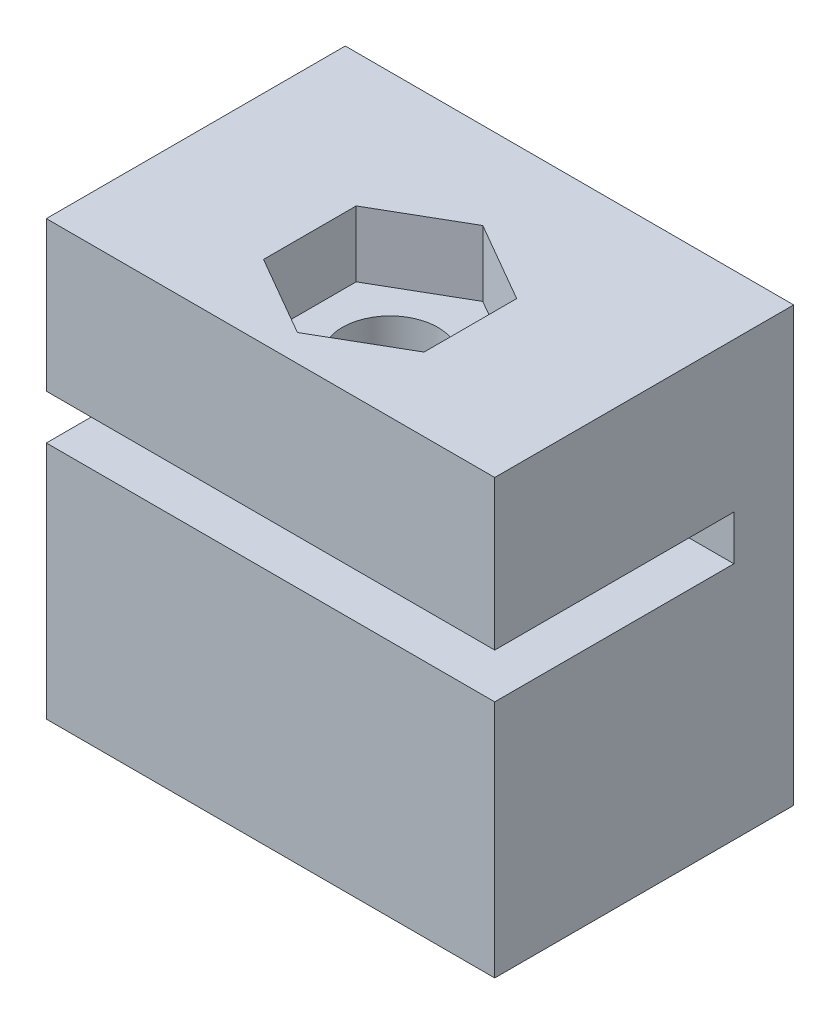
ISO-10303-21;
HEADER;
FILE_DESCRIPTION(('STEP AP214'),'2;1');
FILE_NAME('part.step','',(''),(''),'','','');
FILE_SCHEMA(('AUTOMOTIVE_DESIGN { 1 0 10303 214 1 1 1 1 }'));
ENDSEC;
DATA;
#1=APPLICATION_CONTEXT('core data for automotive mechanical design processes');
#2=APPLICATION_PROTOCOL_DEFINITION('international standard','automotive_design',2000,#1);
#3=PRODUCT_CONTEXT('',#1,'mechanical');
#4=PRODUCT('Part','Part','',(#3));
#5=PRODUCT_RELATED_PRODUCT_CATEGORY('part','',(#4));
#6=PRODUCT_DEFINITION_FORMATION('','',#4);
#7=PRODUCT_DEFINITION_CONTEXT('part definition',#1,'design');
#8=PRODUCT_DEFINITION('design','',#6,#7);
#9=PRODUCT_DEFINITION_SHAPE('','',#8);
#10=(LENGTH_UNIT() NAMED_UNIT(*) SI_UNIT(.MILLI.,.METRE.));
#11=(NAMED_UNIT(*) PLANE_ANGLE_UNIT() SI_UNIT($,.RADIAN.));
#12=(NAMED_UNIT(*) SI_UNIT($,.STERADIAN.) SOLID_ANGLE_UNIT());
#13=UNCERTAINTY_MEASURE_WITH_UNIT(LENGTH_MEASURE(1.E-05),#10,'distance_accuracy_value','');
#14=(GEOMETRIC_REPRESENTATION_CONTEXT(3) GLOBAL_UNCERTAINTY_ASSIGNED_CONTEXT((#13)) GLOBAL_UNIT_ASSIGNED_CONTEXT((#10,
#11,#12)) REPRESENTATION_CONTEXT('',''));
#15=CARTESIAN_POINT('',(0.,0.,0.));
#16=DIRECTION('',(0.,0.,1.));
#17=DIRECTION('',(1.,0.,0.));
#18=AXIS2_PLACEMENT_3D('',#15,#16,#17);
#19=CARTESIAN_POINT('',(0.,0.,1.));
#20=DIRECTION('',(0.,1.,0.));
#21=DIRECTION('',(0.,0.,1.));
#22=AXIS2_PLACEMENT_3D('',#19,#20,#21);
#23=CYLINDRICAL_SURFACE('',#22,1.6);
#24=CARTESIAN_POINT('',(0.,9.5,1.));
#25=DIRECTION('',(0.,1.,0.));
#26=DIRECTION('',(0.,0.,1.));
#27=AXIS2_PLACEMENT_3D('',#24,#25,#26);
#28=CIRCLE('',#27,1.6);
#29=CARTESIAN_POINT('',(0.,9.5,2.6));
#30=VERTEX_POINT('',#29);
#31=EDGE_CURVE('E223',#30,#30,#28,.T.);
#32=ORIENTED_EDGE('',*,*,#31,.F.);
#33=EDGE_LOOP('',(#32));
#34=FACE_BOUND('',#33,.T.);
#35=CARTESIAN_POINT('',(0.,12.3,1.));
#36=DIRECTION('',(0.,1.,0.));
#37=DIRECTION('',(0.,0.,1.));
#38=AXIS2_PLACEMENT_3D('',#35,#36,#37);
#39=CIRCLE('',#38,1.6);
#40=CARTESIAN_POINT('',(0.,12.3,2.6));
#41=VERTEX_POINT('',#40);
#42=EDGE_CURVE('E47',#41,#41,#39,.F.);
#43=ORIENTED_EDGE('',*,*,#42,.F.);
#44=EDGE_LOOP('',(#43));
#45=FACE_BOUND('',#44,.T.);
#46=ADVANCED_FACE('F43',(#34,#45),#23,.F.);
#47=CARTESIAN_POINT('',(7.5,8.,-5.));
#48=DIRECTION('',(-1.,0.,0.));
#49=DIRECTION('',(0.,0.,1.));
#50=AXIS2_PLACEMENT_3D('',#47,#48,#49);
#51=PLANE('',#50);
#52=DIRECTION('',(0.,0.,-1.));
#53=VECTOR('',#52,1.);
#54=CARTESIAN_POINT('',(7.5,0.,-5.));
#55=LINE('',#54,#53);
#56=CARTESIAN_POINT('',(7.5,0.,5.));
#57=VERTEX_POINT('',#56);
#58=CARTESIAN_POINT('',(7.5,0.,-5.));
#59=VERTEX_POINT('',#58);
#60=EDGE_CURVE('E278',#57,#59,#55,.T.);
#61=ORIENTED_EDGE('',*,*,#60,.T.);
#62=DIRECTION('',(0.,-1.,0.));
#63=VECTOR('',#62,1.);
#64=CARTESIAN_POINT('',(7.5,8.,-5.));
#65=LINE('',#64,#63);
#66=CARTESIAN_POINT('',(7.5,14.5,-5.));
#67=VERTEX_POINT('',#66);
#68=EDGE_CURVE('E11',#67,#59,#65,.T.);
#69=ORIENTED_EDGE('',*,*,#68,.F.);
#70=DIRECTION('',(0.,0.,-1.));
#71=VECTOR('',#70,1.);
#72=CARTESIAN_POINT('',(7.5,14.5,-5.));
#73=LINE('',#72,#71);
#74=CARTESIAN_POINT('',(7.5,14.5,5.));
#75=VERTEX_POINT('',#74);
#76=EDGE_CURVE('E240',#75,#67,#73,.T.);
#77=ORIENTED_EDGE('',*,*,#76,.F.);
#78=DIRECTION('',(0.,-1.,0.));
#79=VECTOR('',#78,1.);
#80=CARTESIAN_POINT('',(7.5,14.5,5.));
#81=LINE('',#80,#79);
#82=CARTESIAN_POINT('',(7.5,9.5,5.));
#83=VERTEX_POINT('',#82);
#84=EDGE_CURVE('E248',#75,#83,#81,.T.);
#85=ORIENTED_EDGE('',*,*,#84,.T.);
#86=DIRECTION('',(0.,0.,-1.));
#87=VECTOR('',#86,1.);
#88=CARTESIAN_POINT('',(7.5,9.5,-5.));
#89=LINE('',#88,#87);
#90=CARTESIAN_POINT('',(7.5,9.5,-3.));
#91=VERTEX_POINT('',#90);
#92=EDGE_CURVE('E237',#83,#91,#89,.T.);
#93=ORIENTED_EDGE('',*,*,#92,.T.);
#94=DIRECTION('',(0.,-1.,0.));
#95=VECTOR('',#94,1.);
#96=CARTESIAN_POINT('',(7.5,9.5,-3.));
#97=LINE('',#96,#95);
#98=CARTESIAN_POINT('',(7.5,8.,-3.));
#99=VERTEX_POINT('',#98);
#100=EDGE_CURVE('E268',#91,#99,#97,.T.);
#101=ORIENTED_EDGE('',*,*,#100,.T.);
#102=DIRECTION('',(0.,0.,-1.));
#103=VECTOR('',#102,1.);
#104=CARTESIAN_POINT('',(7.5,8.,-5.));
#105=LINE('',#104,#103);
#106=CARTESIAN_POINT('',(7.5,8.,5.));
#107=VERTEX_POINT('',#106);
#108=EDGE_CURVE('E279',#107,#99,#105,.T.);
#109=ORIENTED_EDGE('',*,*,#108,.F.);
#110=DIRECTION('',(0.,-1.,0.));
#111=VECTOR('',#110,1.);
#112=CARTESIAN_POINT('',(7.5,8.,5.));
#113=LINE('',#112,#111);
#114=EDGE_CURVE('E289',#107,#57,#113,.T.);
#115=ORIENTED_EDGE('',*,*,#114,.T.);
#116=EDGE_LOOP('',(#61,#69,#77,#85,#93,#101,#109,#115));
#117=FACE_BOUND('',#116,.T.);
#118=ADVANCED_FACE('F45',(#117),#51,.F.);
#119=CARTESIAN_POINT('',(-7.5,8.,-5.));
#120=DIRECTION('',(0.,0.,1.));
#121=DIRECTION('',(1.,0.,0.));
#122=AXIS2_PLACEMENT_3D('',#119,#120,#121);
#123=PLANE('',#122);
#124=DIRECTION('',(-1.,0.,0.));
#125=VECTOR('',#124,1.);
#126=CARTESIAN_POINT('',(-7.5,0.,-5.));
#127=LINE('',#126,#125);
#128=CARTESIAN_POINT('',(-7.5,0.,-5.));
#129=VERTEX_POINT('',#128);
#130=EDGE_CURVE('E293',#59,#129,#127,.T.);
#131=ORIENTED_EDGE('',*,*,#130,.T.);
#132=DIRECTION('',(0.,-1.,0.));
#133=VECTOR('',#132,1.);
#134=CARTESIAN_POINT('',(-7.5,8.,-5.));
#135=LINE('',#134,#133);
#136=CARTESIAN_POINT('',(-7.5,14.5,-5.));
#137=VERTEX_POINT('',#136);
#138=EDGE_CURVE('E53',#137,#129,#135,.T.);
#139=ORIENTED_EDGE('',*,*,#138,.F.);
#140=DIRECTION('',(-1.,0.,0.));
#141=VECTOR('',#140,1.);
#142=CARTESIAN_POINT('',(-7.5,14.5,-5.));
#143=LINE('',#142,#141);
#144=EDGE_CURVE('E244',#67,#137,#143,.T.);
#145=ORIENTED_EDGE('',*,*,#144,.F.);
#146=ORIENTED_EDGE('',*,*,#68,.T.);
#147=EDGE_LOOP('',(#131,#139,#145,#146));
#148=FACE_BOUND('',#147,.T.);
#149=ADVANCED_FACE('F343',(#148),#123,.F.);
#150=CARTESIAN_POINT('',(-7.5,8.,-5.));
#151=DIRECTION('',(1.,0.,0.));
#152=DIRECTION('',(0.,0.,-1.));
#153=AXIS2_PLACEMENT_3D('',#150,#151,#152);
#154=PLANE('',#153);
#155=DIRECTION('',(0.,0.,1.));
#156=VECTOR('',#155,1.);
#157=CARTESIAN_POINT('',(-7.5,0.,-5.));
#158=LINE('',#157,#156);
#159=CARTESIAN_POINT('',(-7.5,0.,5.));
#160=VERTEX_POINT('',#159);
#161=EDGE_CURVE('E296',#129,#160,#158,.T.);
#162=ORIENTED_EDGE('',*,*,#161,.T.);
#163=DIRECTION('',(0.,-1.,0.));
#164=VECTOR('',#163,1.);
#165=CARTESIAN_POINT('',(-7.5,8.,5.));
#166=LINE('',#165,#164);
#167=CARTESIAN_POINT('',(-7.5,8.,5.));
#168=VERTEX_POINT('',#167);
#169=EDGE_CURVE('E304',#168,#160,#166,.T.);
#170=ORIENTED_EDGE('',*,*,#169,.F.);
#171=DIRECTION('',(0.,0.,1.));
#172=VECTOR('',#171,1.);
#173=CARTESIAN_POINT('',(-7.5,8.,-5.));
#174=LINE('',#173,#172);
#175=CARTESIAN_POINT('',(-7.5,8.,-3.));
#176=VERTEX_POINT('',#175);
#177=EDGE_CURVE('E282',#176,#168,#174,.T.);
#178=ORIENTED_EDGE('',*,*,#177,.F.);
#179=DIRECTION('',(0.,-1.,0.));
#180=VECTOR('',#179,1.);
#181=CARTESIAN_POINT('',(-7.5,9.5,-3.));
#182=LINE('',#181,#180);
#183=CARTESIAN_POINT('',(-7.5,9.5,-3.));
#184=VERTEX_POINT('',#183);
#185=EDGE_CURVE('E274',#184,#176,#182,.T.);
#186=ORIENTED_EDGE('',*,*,#185,.F.);
#187=DIRECTION('',(0.,0.,1.));
#188=VECTOR('',#187,1.);
#189=CARTESIAN_POINT('',(-7.5,9.5,-5.));
#190=LINE('',#189,#188);
#191=CARTESIAN_POINT('',(-7.5,9.5,5.));
#192=VERTEX_POINT('',#191);
#193=EDGE_CURVE('E231',#184,#192,#190,.T.);
#194=ORIENTED_EDGE('',*,*,#193,.T.);
#195=DIRECTION('',(0.,-1.,0.));
#196=VECTOR('',#195,1.);
#197=CARTESIAN_POINT('',(-7.5,14.5,5.));
#198=LINE('',#197,#196);
#199=CARTESIAN_POINT('',(-7.5,14.5,5.));
#200=VERTEX_POINT('',#199);
#201=EDGE_CURVE('E260',#200,#192,#198,.T.);
#202=ORIENTED_EDGE('',*,*,#201,.F.);
#203=DIRECTION('',(0.,0.,1.));
#204=VECTOR('',#203,1.);
#205=CARTESIAN_POINT('',(-7.5,14.5,-5.));
#206=LINE('',#205,#204);
#207=EDGE_CURVE('E232',#137,#200,#206,.T.);
#208=ORIENTED_EDGE('',*,*,#207,.F.);
#209=ORIENTED_EDGE('',*,*,#138,.T.);
#210=EDGE_LOOP('',(#162,#170,#178,#186,#194,#202,#208,#209));
#211=FACE_BOUND('',#210,.T.);
#212=ADVANCED_FACE('F313',(#211),#154,.F.);
#213=CARTESIAN_POINT('',(-7.5,8.,5.));
#214=DIRECTION('',(0.,0.,-1.));
#215=DIRECTION('',(-1.,0.,0.));
#216=AXIS2_PLACEMENT_3D('',#213,#214,#215);
#217=PLANE('',#216);
#218=DIRECTION('',(1.,0.,0.));
#219=VECTOR('',#218,1.);
#220=CARTESIAN_POINT('',(-7.5,0.,5.));
#221=LINE('',#220,#219);
#222=EDGE_CURVE('E283',#160,#57,#221,.T.);
#223=ORIENTED_EDGE('',*,*,#222,.T.);
#224=ORIENTED_EDGE('',*,*,#114,.F.);
#225=DIRECTION('',(1.,0.,0.));
#226=VECTOR('',#225,1.);
#227=CARTESIAN_POINT('',(-7.5,8.,5.));
#228=LINE('',#227,#226);
#229=EDGE_CURVE('E286',#168,#107,#228,.T.);
#230=ORIENTED_EDGE('',*,*,#229,.F.);
#231=ORIENTED_EDGE('',*,*,#169,.T.);
#232=EDGE_LOOP('',(#223,#224,#230,#231));
#233=FACE_BOUND('',#232,.T.);
#234=ADVANCED_FACE('F324',(#233),#217,.F.);
#235=CARTESIAN_POINT('',(0.,8.,0.));
#236=DIRECTION('',(0.,1.,0.));
#237=DIRECTION('',(0.,0.,1.));
#238=AXIS2_PLACEMENT_3D('',#235,#236,#237);
#239=PLANE('',#238);
#240=CARTESIAN_POINT('',(0.,8.,1.));
#241=DIRECTION('',(0.,1.,0.));
#242=DIRECTION('',(0.,0.,1.));
#243=AXIS2_PLACEMENT_3D('',#240,#241,#242);
#244=CIRCLE('',#243,1.6);
#245=CARTESIAN_POINT('',(0.,8.,2.6));
#246=VERTEX_POINT('',#245);
#247=EDGE_CURVE('E227',#246,#246,#244,.T.);
#248=ORIENTED_EDGE('',*,*,#247,.F.);
#249=EDGE_LOOP('',(#248));
#250=FACE_BOUND('',#249,.T.);
#251=DIRECTION('',(1.,0.,0.));
#252=VECTOR('',#251,1.);
#253=CARTESIAN_POINT('',(0.,8.,-3.));
#254=LINE('',#253,#252);
#255=EDGE_CURVE('E68',#176,#99,#254,.T.);
#256=ORIENTED_EDGE('',*,*,#255,.F.);
#257=ORIENTED_EDGE('',*,*,#177,.T.);
#258=ORIENTED_EDGE('',*,*,#229,.T.);
#259=ORIENTED_EDGE('',*,*,#108,.T.);
#260=EDGE_LOOP('',(#256,#257,#258,#259));
#261=FACE_BOUND('',#260,.T.);
#262=ADVANCED_FACE('F328',(#250,#261),#239,.T.);
#263=CARTESIAN_POINT('',(0.,0.,0.));
#264=DIRECTION('',(0.,1.,0.));
#265=DIRECTION('',(0.,0.,1.));
#266=AXIS2_PLACEMENT_3D('',#263,#264,#265);
#267=PLANE('',#266);
#268=CARTESIAN_POINT('',(0.,0.,1.));
#269=DIRECTION('',(0.,1.,0.));
#270=DIRECTION('',(0.,0.,1.));
#271=AXIS2_PLACEMENT_3D('',#268,#269,#270);
#272=CIRCLE('',#271,1.6);
#273=CARTESIAN_POINT('',(0.,0.,2.6));
#274=VERTEX_POINT('',#273);
#275=EDGE_CURVE('E219',#274,#274,#272,.T.);
#276=ORIENTED_EDGE('',*,*,#275,.T.);
#277=EDGE_LOOP('',(#276));
#278=FACE_BOUND('',#277,.T.);
#279=ORIENTED_EDGE('',*,*,#60,.F.);
#280=ORIENTED_EDGE('',*,*,#222,.F.);
#281=ORIENTED_EDGE('',*,*,#161,.F.);
#282=ORIENTED_EDGE('',*,*,#130,.F.);
#283=EDGE_LOOP('',(#279,#280,#281,#282));
#284=FACE_BOUND('',#283,.T.);
#285=ADVANCED_FACE('F321',(#278,#284),#267,.F.);
#286=CARTESIAN_POINT('',(0.,9.5,-3.));
#287=DIRECTION('',(0.,0.,-1.));
#288=DIRECTION('',(-1.,0.,0.));
#289=AXIS2_PLACEMENT_3D('',#286,#287,#288);
#290=PLANE('',#289);
#291=ORIENTED_EDGE('',*,*,#255,.T.);
#292=ORIENTED_EDGE('',*,*,#100,.F.);
#293=DIRECTION('',(1.,0.,0.));
#294=VECTOR('',#293,1.);
#295=CARTESIAN_POINT('',(0.,9.5,-3.));
#296=LINE('',#295,#294);
#297=EDGE_CURVE('E264',#184,#91,#296,.T.);
#298=ORIENTED_EDGE('',*,*,#297,.F.);
#299=ORIENTED_EDGE('',*,*,#185,.T.);
#300=EDGE_LOOP('',(#291,#292,#298,#299));
#301=FACE_BOUND('',#300,.T.);
#302=ADVANCED_FACE('F330',(#301),#290,.F.);
#303=CARTESIAN_POINT('',(0.,9.5,0.));
#304=DIRECTION('',(0.,1.,0.));
#305=DIRECTION('',(0.,0.,1.));
#306=AXIS2_PLACEMENT_3D('',#303,#304,#305);
#307=PLANE('',#306);
#308=ORIENTED_EDGE('',*,*,#31,.T.);
#309=EDGE_LOOP('',(#308));
#310=FACE_BOUND('',#309,.T.);
#311=ORIENTED_EDGE('',*,*,#193,.F.);
#312=ORIENTED_EDGE('',*,*,#297,.T.);
#313=ORIENTED_EDGE('',*,*,#92,.F.);
#314=DIRECTION('',(1.,0.,0.));
#315=VECTOR('',#314,1.);
#316=CARTESIAN_POINT('',(-7.5,9.5,5.));
#317=LINE('',#316,#315);
#318=EDGE_CURVE('E251',#192,#83,#317,.T.);
#319=ORIENTED_EDGE('',*,*,#318,.F.);
#320=EDGE_LOOP('',(#311,#312,#313,#319));
#321=FACE_BOUND('',#320,.T.);
#322=ADVANCED_FACE('F335',(#310,#321),#307,.F.);
#323=CARTESIAN_POINT('',(-7.5,14.5,5.));
#324=DIRECTION('',(0.,0.,-1.));
#325=DIRECTION('',(-1.,0.,0.));
#326=AXIS2_PLACEMENT_3D('',#323,#324,#325);
#327=PLANE('',#326);
#328=ORIENTED_EDGE('',*,*,#318,.T.);
#329=ORIENTED_EDGE('',*,*,#84,.F.);
#330=DIRECTION('',(1.,0.,0.));
#331=VECTOR('',#330,1.);
#332=CARTESIAN_POINT('',(-7.5,14.5,5.));
#333=LINE('',#332,#331);
#334=EDGE_CURVE('E236',#200,#75,#333,.T.);
#335=ORIENTED_EDGE('',*,*,#334,.F.);
#336=ORIENTED_EDGE('',*,*,#201,.T.);
#337=EDGE_LOOP('',(#328,#329,#335,#336));
#338=FACE_BOUND('',#337,.T.);
#339=ADVANCED_FACE('F339',(#338),#327,.F.);
#340=CARTESIAN_POINT('',(0.,14.5,0.));
#341=DIRECTION('',(0.,1.,0.));
#342=DIRECTION('',(0.,0.,1.));
#343=AXIS2_PLACEMENT_3D('',#340,#341,#342);
#344=PLANE('',#343);
#345=DIRECTION('',(0.866025403784439,0.,0.5));
#346=VECTOR('',#345,1.);
#347=CARTESIAN_POINT('',(-2.68467875173176,14.5,2.55));
#348=LINE('',#347,#346);
#349=CARTESIAN_POINT('',(-2.68467875173176,14.5,2.55));
#350=VERTEX_POINT('',#349);
#351=CARTESIAN_POINT('',(0.,14.5,4.1));
#352=VERTEX_POINT('',#351);
#353=EDGE_CURVE('E60',#350,#352,#348,.T.);
#354=ORIENTED_EDGE('',*,*,#353,.F.);
#355=DIRECTION('',(0.,0.,1.));
#356=VECTOR('',#355,1.);
#357=CARTESIAN_POINT('',(-2.68467875173176,14.5,-0.55));
#358=LINE('',#357,#356);
#359=CARTESIAN_POINT('',(-2.68467875173176,14.5,-0.55));
#360=VERTEX_POINT('',#359);
#361=EDGE_CURVE('E171',#360,#350,#358,.T.);
#362=ORIENTED_EDGE('',*,*,#361,.F.);
#363=DIRECTION('',(-0.866025403784439,0.,0.5));
#364=VECTOR('',#363,1.);
#365=CARTESIAN_POINT('',(0.,14.5,-2.1));
#366=LINE('',#365,#364);
#367=CARTESIAN_POINT('',(0.,14.5,-2.1));
#368=VERTEX_POINT('',#367);
#369=EDGE_CURVE('E175',#368,#360,#366,.T.);
#370=ORIENTED_EDGE('',*,*,#369,.F.);
#371=DIRECTION('',(-0.866025403784439,0.,-0.5));
#372=VECTOR('',#371,1.);
#373=CARTESIAN_POINT('',(2.68467875173176,14.5,-0.55));
#374=LINE('',#373,#372);
#375=CARTESIAN_POINT('',(2.68467875173176,14.5,-0.55));
#376=VERTEX_POINT('',#375);
#377=EDGE_CURVE('E198',#376,#368,#374,.T.);
#378=ORIENTED_EDGE('',*,*,#377,.F.);
#379=DIRECTION('',(0.,0.,-1.));
#380=VECTOR('',#379,1.);
#381=CARTESIAN_POINT('',(2.68467875173176,14.5,2.55));
#382=LINE('',#381,#380);
#383=CARTESIAN_POINT('',(2.68467875173176,14.5,2.55));
#384=VERTEX_POINT('',#383);
#385=EDGE_CURVE('E194',#384,#376,#382,.T.);
#386=ORIENTED_EDGE('',*,*,#385,.F.);
#387=DIRECTION('',(0.866025403784438,0.,-0.5));
#388=VECTOR('',#387,1.);
#389=CARTESIAN_POINT('',(0.,14.5,4.1));
#390=LINE('',#389,#388);
#391=EDGE_CURVE('E191',#352,#384,#390,.T.);
#392=ORIENTED_EDGE('',*,*,#391,.F.);
#393=EDGE_LOOP('',(#354,#362,#370,#378,#386,#392));
#394=FACE_BOUND('',#393,.T.);
#395=ORIENTED_EDGE('',*,*,#207,.T.);
#396=ORIENTED_EDGE('',*,*,#334,.T.);
#397=ORIENTED_EDGE('',*,*,#76,.T.);
#398=ORIENTED_EDGE('',*,*,#144,.T.);
#399=EDGE_LOOP('',(#395,#396,#397,#398));
#400=FACE_BOUND('',#399,.T.);
#401=ADVANCED_FACE('F342',(#394,#400),#344,.T.);
#402=ORIENTED_EDGE('',*,*,#247,.T.);
#403=EDGE_LOOP('',(#402));
#404=FACE_BOUND('',#403,.T.);
#405=ORIENTED_EDGE('',*,*,#275,.F.);
#406=EDGE_LOOP('',(#405));
#407=FACE_BOUND('',#406,.T.);
#408=ADVANCED_FACE('F353',(#404,#407),#23,.F.);
#409=CARTESIAN_POINT('',(0.,12.3,0.));
#410=DIRECTION('',(0.,1.,0.));
#411=DIRECTION('',(0.,0.,1.));
#412=AXIS2_PLACEMENT_3D('',#409,#410,#411);
#413=PLANE('',#412);
#414=DIRECTION('',(0.866025403784439,0.,0.5));
#415=VECTOR('',#414,1.);
#416=CARTESIAN_POINT('',(-2.68467875173176,12.3,2.55));
#417=LINE('',#416,#415);
#418=CARTESIAN_POINT('',(-2.68467875173176,12.3,2.55));
#419=VERTEX_POINT('',#418);
#420=CARTESIAN_POINT('',(0.,12.3,4.1));
#421=VERTEX_POINT('',#420);
#422=EDGE_CURVE('E148',#419,#421,#417,.T.);
#423=ORIENTED_EDGE('',*,*,#422,.T.);
#424=DIRECTION('',(0.866025403784438,0.,-0.5));
#425=VECTOR('',#424,1.);
#426=CARTESIAN_POINT('',(0.,12.3,4.1));
#427=LINE('',#426,#425);
#428=CARTESIAN_POINT('',(2.68467875173176,12.3,2.55));
#429=VERTEX_POINT('',#428);
#430=EDGE_CURVE('E158',#421,#429,#427,.T.);
#431=ORIENTED_EDGE('',*,*,#430,.T.);
#432=DIRECTION('',(0.,0.,-1.));
#433=VECTOR('',#432,1.);
#434=CARTESIAN_POINT('',(2.68467875173176,12.3,2.55));
#435=LINE('',#434,#433);
#436=CARTESIAN_POINT('',(2.68467875173176,12.3,-0.55));
#437=VERTEX_POINT('',#436);
#438=EDGE_CURVE('E164',#429,#437,#435,.T.);
#439=ORIENTED_EDGE('',*,*,#438,.T.);
#440=DIRECTION('',(-0.866025403784439,0.,-0.5));
#441=VECTOR('',#440,1.);
#442=CARTESIAN_POINT('',(2.68467875173176,12.3,-0.55));
#443=LINE('',#442,#441);
#444=CARTESIAN_POINT('',(0.,12.3,-2.1));
#445=VERTEX_POINT('',#444);
#446=EDGE_CURVE('E180',#437,#445,#443,.T.);
#447=ORIENTED_EDGE('',*,*,#446,.T.);
#448=DIRECTION('',(-0.866025403784439,0.,0.5));
#449=VECTOR('',#448,1.);
#450=CARTESIAN_POINT('',(0.,12.3,-2.1));
#451=LINE('',#450,#449);
#452=CARTESIAN_POINT('',(-2.68467875173176,12.3,-0.55));
#453=VERTEX_POINT('',#452);
#454=EDGE_CURVE('E184',#445,#453,#451,.T.);
#455=ORIENTED_EDGE('',*,*,#454,.T.);
#456=DIRECTION('',(0.,0.,1.));
#457=VECTOR('',#456,1.);
#458=CARTESIAN_POINT('',(-2.68467875173176,12.3,-0.55));
#459=LINE('',#458,#457);
#460=EDGE_CURVE('E155',#453,#419,#459,.T.);
#461=ORIENTED_EDGE('',*,*,#460,.T.);
#462=EDGE_LOOP('',(#423,#431,#439,#447,#455,#461));
#463=FACE_BOUND('',#462,.T.);
#464=ORIENTED_EDGE('',*,*,#42,.T.);
#465=EDGE_LOOP('',(#464));
#466=FACE_BOUND('',#465,.T.);
#467=ADVANCED_FACE('F166',(#463,#466),#413,.T.);
#468=CARTESIAN_POINT('',(-2.68467875173176,12.3,2.55));
#469=DIRECTION('',(-0.5,0.,0.866025403784439));
#470=DIRECTION('',(0.866025403784439,0.,0.5));
#471=AXIS2_PLACEMENT_3D('',#468,#469,#470);
#472=PLANE('',#471);
#473=ORIENTED_EDGE('',*,*,#353,.T.);
#474=DIRECTION('',(0.,1.,0.));
#475=VECTOR('',#474,1.);
#476=CARTESIAN_POINT('',(0.,12.3,4.1));
#477=LINE('',#476,#475);
#478=EDGE_CURVE('E144',#421,#352,#477,.T.);
#479=ORIENTED_EDGE('',*,*,#478,.F.);
#480=ORIENTED_EDGE('',*,*,#422,.F.);
#481=DIRECTION('',(0.,1.,0.));
#482=VECTOR('',#481,1.);
#483=CARTESIAN_POINT('',(-2.68467875173176,12.3,2.55));
#484=LINE('',#483,#482);
#485=EDGE_CURVE('E205',#419,#350,#484,.T.);
#486=ORIENTED_EDGE('',*,*,#485,.T.);
#487=EDGE_LOOP('',(#473,#479,#480,#486));
#488=FACE_BOUND('',#487,.T.);
#489=ADVANCED_FACE('F146',(#488),#472,.F.);
#490=CARTESIAN_POINT('',(-2.68467875173176,12.3,-0.55));
#491=DIRECTION('',(-1.,0.,0.));
#492=DIRECTION('',(0.,0.,1.));
#493=AXIS2_PLACEMENT_3D('',#490,#491,#492);
#494=PLANE('',#493);
#495=ORIENTED_EDGE('',*,*,#361,.T.);
#496=ORIENTED_EDGE('',*,*,#485,.F.);
#497=ORIENTED_EDGE('',*,*,#460,.F.);
#498=DIRECTION('',(0.,1.,0.));
#499=VECTOR('',#498,1.);
#500=CARTESIAN_POINT('',(-2.68467875173176,12.3,-0.55));
#501=LINE('',#500,#499);
#502=EDGE_CURVE('E208',#453,#360,#501,.T.);
#503=ORIENTED_EDGE('',*,*,#502,.T.);
#504=EDGE_LOOP('',(#495,#496,#497,#503));
#505=FACE_BOUND('',#504,.T.);
#506=ADVANCED_FACE('F441',(#505),#494,.F.);
#507=CARTESIAN_POINT('',(0.,12.3,-2.1));
#508=DIRECTION('',(-0.5,0.,-0.866025403784439));
#509=DIRECTION('',(-0.866025403784439,0.,0.5));
#510=AXIS2_PLACEMENT_3D('',#507,#508,#509);
#511=PLANE('',#510);
#512=ORIENTED_EDGE('',*,*,#369,.T.);
#513=ORIENTED_EDGE('',*,*,#502,.F.);
#514=ORIENTED_EDGE('',*,*,#454,.F.);
#515=DIRECTION('',(0.,1.,0.));
#516=VECTOR('',#515,1.);
#517=CARTESIAN_POINT('',(0.,12.3,-2.1));
#518=LINE('',#517,#516);
#519=EDGE_CURVE('E211',#445,#368,#518,.T.);
#520=ORIENTED_EDGE('',*,*,#519,.T.);
#521=EDGE_LOOP('',(#512,#513,#514,#520));
#522=FACE_BOUND('',#521,.T.);
#523=ADVANCED_FACE('F449',(#522),#511,.F.);
#524=CARTESIAN_POINT('',(2.68467875173176,12.3,-0.55));
#525=DIRECTION('',(0.5,0.,-0.866025403784438));
#526=DIRECTION('',(-0.866025403784439,0.,-0.5));
#527=AXIS2_PLACEMENT_3D('',#524,#525,#526);
#528=PLANE('',#527);
#529=ORIENTED_EDGE('',*,*,#377,.T.);
#530=ORIENTED_EDGE('',*,*,#519,.F.);
#531=ORIENTED_EDGE('',*,*,#446,.F.);
#532=DIRECTION('',(0.,1.,0.));
#533=VECTOR('',#532,1.);
#534=CARTESIAN_POINT('',(2.68467875173176,12.3,-0.55));
#535=LINE('',#534,#533);
#536=EDGE_CURVE('E214',#437,#376,#535,.T.);
#537=ORIENTED_EDGE('',*,*,#536,.T.);
#538=EDGE_LOOP('',(#529,#530,#531,#537));
#539=FACE_BOUND('',#538,.T.);
#540=ADVANCED_FACE('F459',(#539),#528,.F.);
#541=CARTESIAN_POINT('',(2.68467875173176,12.3,2.55));
#542=DIRECTION('',(1.,0.,0.));
#543=DIRECTION('',(0.,0.,-1.));
#544=AXIS2_PLACEMENT_3D('',#541,#542,#543);
#545=PLANE('',#544);
#546=ORIENTED_EDGE('',*,*,#385,.T.);
#547=ORIENTED_EDGE('',*,*,#536,.F.);
#548=ORIENTED_EDGE('',*,*,#438,.F.);
#549=DIRECTION('',(0.,1.,0.));
#550=VECTOR('',#549,1.);
#551=CARTESIAN_POINT('',(2.68467875173176,12.3,2.55));
#552=LINE('',#551,#550);
#553=EDGE_CURVE('E154',#429,#384,#552,.T.);
#554=ORIENTED_EDGE('',*,*,#553,.T.);
#555=EDGE_LOOP('',(#546,#547,#548,#554));
#556=FACE_BOUND('',#555,.T.);
#557=ADVANCED_FACE('F469',(#556),#545,.F.);
#558=CARTESIAN_POINT('',(0.,12.3,4.1));
#559=DIRECTION('',(0.5,0.,0.866025403784438));
#560=DIRECTION('',(0.866025403784439,0.,-0.5));
#561=AXIS2_PLACEMENT_3D('',#558,#559,#560);
#562=PLANE('',#561);
#563=ORIENTED_EDGE('',*,*,#391,.T.);
#564=ORIENTED_EDGE('',*,*,#553,.F.);
#565=ORIENTED_EDGE('',*,*,#430,.F.);
#566=ORIENTED_EDGE('',*,*,#478,.T.);
#567=EDGE_LOOP('',(#563,#564,#565,#566));
#568=FACE_BOUND('',#567,.T.);
#569=ADVANCED_FACE('F159',(#568),#562,.F.);
#570=CLOSED_SHELL('',(#46,#118,#149,#212,#234,#262,#285,#302,#322,#339,#401,#408,#467,#489,#506,
#523,#540,#557,#569));
#571=MANIFOLD_SOLID_BREP('B2',#570);
#572=ADVANCED_BREP_SHAPE_REPRESENTATION('',(#18,#571),#14);
#573=SHAPE_DEFINITION_REPRESENTATION(#9,#572);
ENDSEC;
END-ISO-10303-21;
